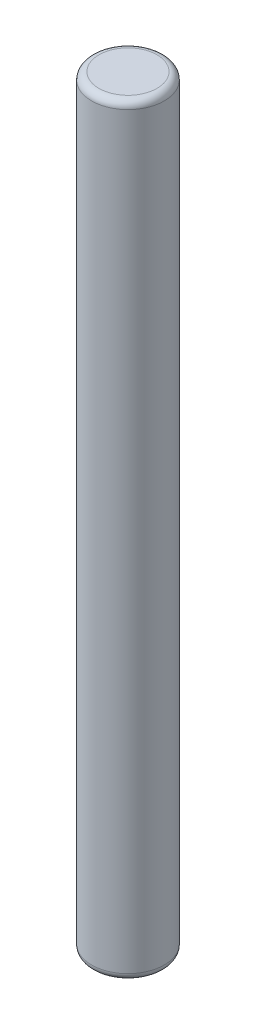
ISO-10303-21;
HEADER;
FILE_DESCRIPTION(('STEP AP214'),'2;1');
FILE_NAME('part.step','',(''),(''),'','','');
FILE_SCHEMA(('AUTOMOTIVE_DESIGN { 1 0 10303 214 1 1 1 1 }'));
ENDSEC;
DATA;
#1=APPLICATION_CONTEXT('core data for automotive mechanical design processes');
#2=APPLICATION_PROTOCOL_DEFINITION('international standard','automotive_design',2000,#1);
#3=PRODUCT_CONTEXT('',#1,'mechanical');
#4=PRODUCT('Part','Part','',(#3));
#5=PRODUCT_RELATED_PRODUCT_CATEGORY('part','',(#4));
#6=PRODUCT_DEFINITION_FORMATION('','',#4);
#7=PRODUCT_DEFINITION_CONTEXT('part definition',#1,'design');
#8=PRODUCT_DEFINITION('design','',#6,#7);
#9=PRODUCT_DEFINITION_SHAPE('','',#8);
#10=(LENGTH_UNIT() NAMED_UNIT(*) SI_UNIT(.MILLI.,.METRE.));
#11=(NAMED_UNIT(*) PLANE_ANGLE_UNIT() SI_UNIT($,.RADIAN.));
#12=(NAMED_UNIT(*) SI_UNIT($,.STERADIAN.) SOLID_ANGLE_UNIT());
#13=UNCERTAINTY_MEASURE_WITH_UNIT(LENGTH_MEASURE(1.E-05),#10,'distance_accuracy_value','');
#14=(GEOMETRIC_REPRESENTATION_CONTEXT(3) GLOBAL_UNCERTAINTY_ASSIGNED_CONTEXT((#13)) GLOBAL_UNIT_ASSIGNED_CONTEXT((#10,
#11,#12)) REPRESENTATION_CONTEXT('',''));
#15=CARTESIAN_POINT('',(0.,0.,0.));
#16=DIRECTION('',(0.,0.,1.));
#17=DIRECTION('',(1.,0.,0.));
#18=AXIS2_PLACEMENT_3D('',#15,#16,#17);
#19=CARTESIAN_POINT('',(0.,-0.5,0.));
#20=DIRECTION('',(0.,1.,0.));
#21=DIRECTION('',(0.,0.,1.));
#22=AXIS2_PLACEMENT_3D('',#19,#20,#21);
#23=CYLINDRICAL_SURFACE('',#22,0.5);
#24=CARTESIAN_POINT('',(0.,-0.4,0.));
#25=DIRECTION('',(0.,1.,0.));
#26=DIRECTION('',(0.,0.,1.));
#27=AXIS2_PLACEMENT_3D('',#24,#25,#26);
#28=CIRCLE('',#27,0.5);
#29=CARTESIAN_POINT('',(0.,-0.4,0.5));
#30=VERTEX_POINT('',#29);
#31=EDGE_CURVE('E46',#30,#30,#28,.T.);
#32=ORIENTED_EDGE('',*,*,#31,.T.);
#33=EDGE_LOOP('',(#32));
#34=FACE_BOUND('',#33,.T.);
#35=CARTESIAN_POINT('',(0.,9.9,0.));
#36=DIRECTION('',(0.,1.,0.));
#37=DIRECTION('',(0.,0.,1.));
#38=AXIS2_PLACEMENT_3D('',#35,#36,#37);
#39=CIRCLE('',#38,0.5);
#40=CARTESIAN_POINT('',(0.,9.9,0.5));
#41=VERTEX_POINT('',#40);
#42=EDGE_CURVE('E50',#41,#41,#39,.F.);
#43=ORIENTED_EDGE('',*,*,#42,.T.);
#44=EDGE_LOOP('',(#43));
#45=FACE_BOUND('',#44,.T.);
#46=ADVANCED_FACE('F35',(#34,#45),#23,.T.);
#47=CARTESIAN_POINT('',(0.,-0.5,0.));
#48=DIRECTION('',(0.,1.,0.));
#49=DIRECTION('',(0.,0.,1.));
#50=AXIS2_PLACEMENT_3D('',#47,#48,#49);
#51=PLANE('',#50);
#52=CARTESIAN_POINT('',(0.,-0.5,0.));
#53=DIRECTION('',(0.,1.,0.));
#54=DIRECTION('',(0.,0.,1.));
#55=AXIS2_PLACEMENT_3D('',#52,#53,#54);
#56=CIRCLE('',#55,0.4);
#57=CARTESIAN_POINT('',(0.,-0.5,0.4));
#58=VERTEX_POINT('',#57);
#59=EDGE_CURVE('E42',#58,#58,#56,.F.);
#60=ORIENTED_EDGE('',*,*,#59,.T.);
#61=EDGE_LOOP('',(#60));
#62=FACE_BOUND('',#61,.T.);
#63=ADVANCED_FACE('F66',(#62),#51,.F.);
#64=CARTESIAN_POINT('',(0.,10.,0.));
#65=DIRECTION('',(0.,1.,0.));
#66=DIRECTION('',(0.,0.,1.));
#67=AXIS2_PLACEMENT_3D('',#64,#65,#66);
#68=PLANE('',#67);
#69=CARTESIAN_POINT('',(0.,10.,0.));
#70=DIRECTION('',(0.,1.,0.));
#71=DIRECTION('',(0.,0.,1.));
#72=AXIS2_PLACEMENT_3D('',#69,#70,#71);
#73=CIRCLE('',#72,0.4);
#74=CARTESIAN_POINT('',(0.,10.,0.4));
#75=VERTEX_POINT('',#74);
#76=EDGE_CURVE('E10',#75,#75,#73,.T.);
#77=ORIENTED_EDGE('',*,*,#76,.T.);
#78=EDGE_LOOP('',(#77));
#79=FACE_BOUND('',#78,.T.);
#80=ADVANCED_FACE('F63',(#79),#68,.T.);
#81=CARTESIAN_POINT('',(0.,-0.4,0.));
#82=DIRECTION('',(0.,1.,0.));
#83=DIRECTION('',(0.,0.,1.));
#84=AXIS2_PLACEMENT_3D('',#81,#82,#83);
#85=TOROIDAL_SURFACE('',#84,0.4,0.1);
#86=ORIENTED_EDGE('',*,*,#59,.F.);
#87=EDGE_LOOP('',(#86));
#88=FACE_BOUND('',#87,.T.);
#89=ORIENTED_EDGE('',*,*,#31,.F.);
#90=EDGE_LOOP('',(#89));
#91=FACE_BOUND('',#90,.T.);
#92=ADVANCED_FACE('F59',(#88,#91),#85,.T.);
#93=CARTESIAN_POINT('',(0.,9.9,0.));
#94=DIRECTION('',(0.,1.,0.));
#95=DIRECTION('',(0.,0.,1.));
#96=AXIS2_PLACEMENT_3D('',#93,#94,#95);
#97=TOROIDAL_SURFACE('',#96,0.4,0.1);
#98=ORIENTED_EDGE('',*,*,#42,.F.);
#99=EDGE_LOOP('',(#98));
#100=FACE_BOUND('',#99,.T.);
#101=ORIENTED_EDGE('',*,*,#76,.F.);
#102=EDGE_LOOP('',(#101));
#103=FACE_BOUND('',#102,.T.);
#104=ADVANCED_FACE('F37',(#100,#103),#97,.T.);
#105=CLOSED_SHELL('',(#46,#63,#80,#92,#104));
#106=MANIFOLD_SOLID_BREP('B2',#105);
#107=ADVANCED_BREP_SHAPE_REPRESENTATION('',(#18,#106),#14);
#108=SHAPE_DEFINITION_REPRESENTATION(#9,#107);
ENDSEC;
END-ISO-10303-21;
